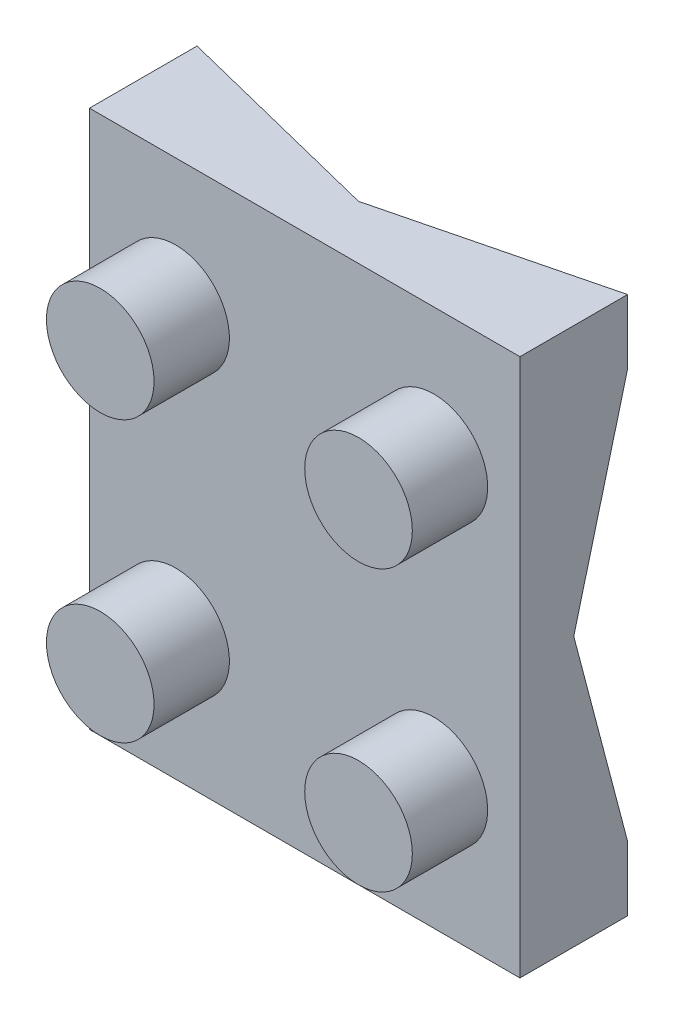
ISO-10303-21;
HEADER;
FILE_DESCRIPTION(('STEP AP214'),'2;1');
FILE_NAME('part.step','',(''),(''),'','','');
FILE_SCHEMA(('AUTOMOTIVE_DESIGN { 1 0 10303 214 1 1 1 1 }'));
ENDSEC;
DATA;
#1=APPLICATION_CONTEXT('core data for automotive mechanical design processes');
#2=APPLICATION_PROTOCOL_DEFINITION('international standard','automotive_design',2000,#1);
#3=PRODUCT_CONTEXT('',#1,'mechanical');
#4=PRODUCT('Part','Part','',(#3));
#5=PRODUCT_RELATED_PRODUCT_CATEGORY('part','',(#4));
#6=PRODUCT_DEFINITION_FORMATION('','',#4);
#7=PRODUCT_DEFINITION_CONTEXT('part definition',#1,'design');
#8=PRODUCT_DEFINITION('design','',#6,#7);
#9=PRODUCT_DEFINITION_SHAPE('','',#8);
#10=(LENGTH_UNIT() NAMED_UNIT(*) SI_UNIT(.MILLI.,.METRE.));
#11=(NAMED_UNIT(*) PLANE_ANGLE_UNIT() SI_UNIT($,.RADIAN.));
#12=(NAMED_UNIT(*) SI_UNIT($,.STERADIAN.) SOLID_ANGLE_UNIT());
#13=UNCERTAINTY_MEASURE_WITH_UNIT(LENGTH_MEASURE(1.E-05),#10,'distance_accuracy_value','');
#14=(GEOMETRIC_REPRESENTATION_CONTEXT(3) GLOBAL_UNCERTAINTY_ASSIGNED_CONTEXT((#13)) GLOBAL_UNIT_ASSIGNED_CONTEXT((#10,
#11,#12)) REPRESENTATION_CONTEXT('',''));
#15=CARTESIAN_POINT('',(0.,0.,0.));
#16=DIRECTION('',(0.,0.,1.));
#17=DIRECTION('',(1.,0.,0.));
#18=AXIS2_PLACEMENT_3D('',#15,#16,#17);
#19=CARTESIAN_POINT('',(-3.5,1.42487046632124,5.41450777202073));
#20=DIRECTION('',(0.,0.254493299279644,0.967074537262646));
#21=DIRECTION('',(0.,-0.967074537262647,0.254493299279644));
#22=AXIS2_PLACEMENT_3D('',#19,#20,#21);
#23=PLANE('',#22);
#24=DIRECTION('',(0.,-0.967074537262647,0.254493299279644));
#25=VECTOR('',#24,1.);
#26=CARTESIAN_POINT('',(0.,0.194300518134715,5.73834196891192));
#27=LINE('',#26,#25);
#28=CARTESIAN_POINT('',(0.,22.,0.));
#29=VERTEX_POINT('',#28);
#30=CARTESIAN_POINT('',(0.,12.5,2.5));
#31=VERTEX_POINT('',#30);
#32=EDGE_CURVE('E182',#29,#31,#27,.T.);
#33=ORIENTED_EDGE('',*,*,#32,.F.);
#34=DIRECTION('',(0.713376375006422,-0.6777075562561,0.178344093751605));
#35=VECTOR('',#34,1.);
#36=CARTESIAN_POINT('',(8.85496183206107,13.587786259542,2.21374045801527));
#37=LINE('',#36,#35);
#38=CARTESIAN_POINT('',(9.99999999999999,12.5,2.5));
#39=VERTEX_POINT('',#38);
#40=EDGE_CURVE('E178',#29,#39,#37,.T.);
#41=ORIENTED_EDGE('',*,*,#40,.T.);
#42=DIRECTION('',(1.,0.,0.));
#43=VECTOR('',#42,1.);
#44=CARTESIAN_POINT('',(-3.5,12.5,2.5));
#45=LINE('',#44,#43);
#46=EDGE_CURVE('E169',#31,#39,#45,.T.);
#47=ORIENTED_EDGE('',*,*,#46,.F.);
#48=EDGE_LOOP('',(#33,#41,#47));
#49=FACE_BOUND('',#48,.T.);
#50=ADVANCED_FACE('F41',(#49),#23,.F.);
#51=CARTESIAN_POINT('',(-3.5,0.194300518134715,-0.738341968911917));
#52=DIRECTION('',(0.,-0.254493299279644,0.967074537262646));
#53=DIRECTION('',(0.,-0.967074537262647,-0.254493299279644));
#54=AXIS2_PLACEMENT_3D('',#51,#52,#53);
#55=PLANE('',#54);
#56=ORIENTED_EDGE('',*,*,#46,.T.);
#57=DIRECTION('',(-0.713376375006422,-0.6777075562561,-0.178344093751605));
#58=VECTOR('',#57,1.);
#59=CARTESIAN_POINT('',(-3.23155216284987,-0.0699745547073758,-0.807888040712468));
#60=LINE('',#59,#58);
#61=CARTESIAN_POINT('',(0.,3.,0.));
#62=VERTEX_POINT('',#61);
#63=EDGE_CURVE('E11',#39,#62,#60,.T.);
#64=ORIENTED_EDGE('',*,*,#63,.T.);
#65=DIRECTION('',(0.,-0.967074537262647,-0.254493299279644));
#66=VECTOR('',#65,1.);
#67=CARTESIAN_POINT('',(0.,1.42487046632124,-0.414507772020725));
#68=LINE('',#67,#66);
#69=EDGE_CURVE('E177',#31,#62,#68,.T.);
#70=ORIENTED_EDGE('',*,*,#69,.F.);
#71=EDGE_LOOP('',(#56,#64,#70));
#72=FACE_BOUND('',#71,.T.);
#73=ADVANCED_FACE('F174',(#72),#55,.F.);
#74=CARTESIAN_POINT('',(0.,0.,5.));
#75=DIRECTION('',(1.,0.,0.));
#76=DIRECTION('',(0.,1.,0.));
#77=AXIS2_PLACEMENT_3D('',#74,#75,#76);
#78=PLANE('',#77);
#79=DIRECTION('',(0.,-1.,0.));
#80=VECTOR('',#79,1.);
#81=CARTESIAN_POINT('',(0.,0.,0.));
#82=LINE('',#81,#80);
#83=CARTESIAN_POINT('',(0.,25.,0.));
#84=VERTEX_POINT('',#83);
#85=EDGE_CURVE('E212',#84,#29,#82,.T.);
#86=ORIENTED_EDGE('',*,*,#85,.T.);
#87=ORIENTED_EDGE('',*,*,#32,.T.);
#88=ORIENTED_EDGE('',*,*,#69,.T.);
#89=CARTESIAN_POINT('',(0.,0.,0.));
#90=VERTEX_POINT('',#89);
#91=EDGE_CURVE('E208',#62,#90,#82,.T.);
#92=ORIENTED_EDGE('',*,*,#91,.T.);
#93=DIRECTION('',(0.,0.,-1.));
#94=VECTOR('',#93,1.);
#95=CARTESIAN_POINT('',(0.,0.,5.));
#96=LINE('',#95,#94);
#97=CARTESIAN_POINT('',(0.,0.,5.));
#98=VERTEX_POINT('',#97);
#99=EDGE_CURVE('E135',#98,#90,#96,.T.);
#100=ORIENTED_EDGE('',*,*,#99,.F.);
#101=DIRECTION('',(0.,-1.,0.));
#102=VECTOR('',#101,1.);
#103=CARTESIAN_POINT('',(0.,0.,5.));
#104=LINE('',#103,#102);
#105=CARTESIAN_POINT('',(0.,25.,5.));
#106=VERTEX_POINT('',#105);
#107=EDGE_CURVE('E122',#106,#98,#104,.T.);
#108=ORIENTED_EDGE('',*,*,#107,.F.);
#109=DIRECTION('',(0.,0.,-1.));
#110=VECTOR('',#109,1.);
#111=CARTESIAN_POINT('',(0.,25.,5.));
#112=LINE('',#111,#110);
#113=EDGE_CURVE('E143',#106,#84,#112,.T.);
#114=ORIENTED_EDGE('',*,*,#113,.T.);
#115=EDGE_LOOP('',(#86,#87,#88,#92,#100,#108,#114));
#116=FACE_BOUND('',#115,.T.);
#117=ADVANCED_FACE('F43',(#116),#78,.F.);
#118=CARTESIAN_POINT('',(0.,0.,5.));
#119=DIRECTION('',(0.,1.,0.));
#120=DIRECTION('',(0.,0.,1.));
#121=AXIS2_PLACEMENT_3D('',#118,#119,#120);
#122=PLANE('',#121);
#123=ORIENTED_EDGE('',*,*,#99,.T.);
#124=DIRECTION('',(-0.970142500145332,0.,-0.242535625036333));
#125=VECTOR('',#124,1.);
#126=CARTESIAN_POINT('',(0.,0.,0.));
#127=LINE('',#126,#125);
#128=CARTESIAN_POINT('',(10.,0.,2.5));
#129=VERTEX_POINT('',#128);
#130=EDGE_CURVE('E128',#129,#90,#127,.T.);
#131=ORIENTED_EDGE('',*,*,#130,.F.);
#132=DIRECTION('',(-0.970142500145332,0.,0.242535625036333));
#133=VECTOR('',#132,1.);
#134=CARTESIAN_POINT('',(10.,0.,2.5));
#135=LINE('',#134,#133);
#136=CARTESIAN_POINT('',(20.,0.,0.));
#137=VERTEX_POINT('',#136);
#138=EDGE_CURVE('E111',#137,#129,#135,.T.);
#139=ORIENTED_EDGE('',*,*,#138,.F.);
#140=DIRECTION('',(0.,0.,-1.));
#141=VECTOR('',#140,1.);
#142=CARTESIAN_POINT('',(20.,0.,5.));
#143=LINE('',#142,#141);
#144=CARTESIAN_POINT('',(20.,0.,5.));
#145=VERTEX_POINT('',#144);
#146=EDGE_CURVE('E126',#145,#137,#143,.T.);
#147=ORIENTED_EDGE('',*,*,#146,.F.);
#148=DIRECTION('',(1.,0.,0.));
#149=VECTOR('',#148,1.);
#150=CARTESIAN_POINT('',(0.,0.,5.));
#151=LINE('',#150,#149);
#152=EDGE_CURVE('E209',#98,#145,#151,.T.);
#153=ORIENTED_EDGE('',*,*,#152,.F.);
#154=EDGE_LOOP('',(#123,#131,#139,#147,#153));
#155=FACE_BOUND('',#154,.T.);
#156=ADVANCED_FACE('F130',(#155),#122,.F.);
#157=CARTESIAN_POINT('',(20.,0.,5.));
#158=DIRECTION('',(-1.,0.,0.));
#159=DIRECTION('',(0.,-1.,0.));
#160=AXIS2_PLACEMENT_3D('',#157,#158,#159);
#161=PLANE('',#160);
#162=DIRECTION('',(0.,-0.967074537262646,-0.254493299279644));
#163=VECTOR('',#162,1.);
#164=CARTESIAN_POINT('',(20.,0.194300518134719,-0.738341968911917));
#165=LINE('',#164,#163);
#166=CARTESIAN_POINT('',(20.,12.5,2.5));
#167=VERTEX_POINT('',#166);
#168=CARTESIAN_POINT('',(20.,3.00000000000002,0.));
#169=VERTEX_POINT('',#168);
#170=EDGE_CURVE('E159',#167,#169,#165,.T.);
#171=ORIENTED_EDGE('',*,*,#170,.F.);
#172=DIRECTION('',(0.,-0.967074537262646,0.254493299279644));
#173=VECTOR('',#172,1.);
#174=CARTESIAN_POINT('',(20.,1.42487046632125,5.41450777202073));
#175=LINE('',#174,#173);
#176=CARTESIAN_POINT('',(20.,22.,0.));
#177=VERTEX_POINT('',#176);
#178=EDGE_CURVE('E170',#177,#167,#175,.T.);
#179=ORIENTED_EDGE('',*,*,#178,.F.);
#180=DIRECTION('',(0.,1.,0.));
#181=VECTOR('',#180,1.);
#182=CARTESIAN_POINT('',(20.,0.,0.));
#183=LINE('',#182,#181);
#184=CARTESIAN_POINT('',(20.,25.,0.));
#185=VERTEX_POINT('',#184);
#186=EDGE_CURVE('E124',#177,#185,#183,.T.);
#187=ORIENTED_EDGE('',*,*,#186,.T.);
#188=DIRECTION('',(0.,0.,-1.));
#189=VECTOR('',#188,1.);
#190=CARTESIAN_POINT('',(20.,25.,5.));
#191=LINE('',#190,#189);
#192=CARTESIAN_POINT('',(20.,25.,5.));
#193=VERTEX_POINT('',#192);
#194=EDGE_CURVE('E137',#193,#185,#191,.T.);
#195=ORIENTED_EDGE('',*,*,#194,.F.);
#196=DIRECTION('',(0.,1.,0.));
#197=VECTOR('',#196,1.);
#198=CARTESIAN_POINT('',(20.,0.,5.));
#199=LINE('',#198,#197);
#200=EDGE_CURVE('E133',#145,#193,#199,.T.);
#201=ORIENTED_EDGE('',*,*,#200,.F.);
#202=ORIENTED_EDGE('',*,*,#146,.T.);
#203=EDGE_CURVE('E109',#137,#169,#183,.T.);
#204=ORIENTED_EDGE('',*,*,#203,.T.);
#205=EDGE_LOOP('',(#171,#179,#187,#195,#201,#202,#204));
#206=FACE_BOUND('',#205,.T.);
#207=ADVANCED_FACE('F132',(#206),#161,.F.);
#208=CARTESIAN_POINT('',(0.,25.,5.));
#209=DIRECTION('',(0.,-1.,0.));
#210=DIRECTION('',(0.,0.,-1.));
#211=AXIS2_PLACEMENT_3D('',#208,#209,#210);
#212=PLANE('',#211);
#213=DIRECTION('',(-0.970142500145332,0.,0.242535625036333));
#214=VECTOR('',#213,1.);
#215=CARTESIAN_POINT('',(0.,25.,5.));
#216=LINE('',#215,#214);
#217=CARTESIAN_POINT('',(10.,25.,2.5));
#218=VERTEX_POINT('',#217);
#219=EDGE_CURVE('E184',#185,#218,#216,.T.);
#220=ORIENTED_EDGE('',*,*,#219,.T.);
#221=DIRECTION('',(-0.970142500145332,0.,-0.242535625036333));
#222=VECTOR('',#221,1.);
#223=CARTESIAN_POINT('',(1.17647058823529,25.,0.294117647058822));
#224=LINE('',#223,#222);
#225=EDGE_CURVE('E181',#218,#84,#224,.T.);
#226=ORIENTED_EDGE('',*,*,#225,.T.);
#227=ORIENTED_EDGE('',*,*,#113,.F.);
#228=DIRECTION('',(-1.,0.,0.));
#229=VECTOR('',#228,1.);
#230=CARTESIAN_POINT('',(0.,25.,5.));
#231=LINE('',#230,#229);
#232=EDGE_CURVE('E63',#193,#106,#231,.T.);
#233=ORIENTED_EDGE('',*,*,#232,.F.);
#234=ORIENTED_EDGE('',*,*,#194,.T.);
#235=EDGE_LOOP('',(#220,#226,#227,#233,#234));
#236=FACE_BOUND('',#235,.T.);
#237=ADVANCED_FACE('F219',(#236),#212,.F.);
#238=CARTESIAN_POINT('',(0.,0.,5.));
#239=DIRECTION('',(0.,0.,-1.));
#240=DIRECTION('',(-1.,0.,0.));
#241=AXIS2_PLACEMENT_3D('',#238,#239,#240);
#242=PLANE('',#241);
#243=CARTESIAN_POINT('',(4.,6.,5.));
#244=DIRECTION('',(0.,0.,-1.));
#245=DIRECTION('',(-1.,0.,0.));
#246=AXIS2_PLACEMENT_3D('',#243,#244,#245);
#247=CIRCLE('',#246,2.5);
#248=CARTESIAN_POINT('',(1.5,6.,5.));
#249=VERTEX_POINT('',#248);
#250=EDGE_CURVE('E153',#249,#249,#247,.F.);
#251=ORIENTED_EDGE('',*,*,#250,.F.);
#252=EDGE_LOOP('',(#251));
#253=FACE_BOUND('',#252,.T.);
#254=CARTESIAN_POINT('',(16.,6.,5.));
#255=DIRECTION('',(0.,0.,-1.));
#256=DIRECTION('',(-1.,0.,0.));
#257=AXIS2_PLACEMENT_3D('',#254,#255,#256);
#258=CIRCLE('',#257,2.5);
#259=CARTESIAN_POINT('',(13.5,6.,5.));
#260=VERTEX_POINT('',#259);
#261=EDGE_CURVE('E147',#260,#260,#258,.F.);
#262=ORIENTED_EDGE('',*,*,#261,.F.);
#263=EDGE_LOOP('',(#262));
#264=FACE_BOUND('',#263,.T.);
#265=CARTESIAN_POINT('',(16.,19.,5.));
#266=DIRECTION('',(0.,0.,-1.));
#267=DIRECTION('',(-1.,0.,0.));
#268=AXIS2_PLACEMENT_3D('',#265,#266,#267);
#269=CIRCLE('',#268,2.5);
#270=CARTESIAN_POINT('',(13.5,19.,5.));
#271=VERTEX_POINT('',#270);
#272=EDGE_CURVE('E150',#271,#271,#269,.F.);
#273=ORIENTED_EDGE('',*,*,#272,.F.);
#274=EDGE_LOOP('',(#273));
#275=FACE_BOUND('',#274,.T.);
#276=CARTESIAN_POINT('',(4.,19.,5.));
#277=DIRECTION('',(0.,0.,-1.));
#278=DIRECTION('',(-1.,0.,0.));
#279=AXIS2_PLACEMENT_3D('',#276,#277,#278);
#280=CIRCLE('',#279,2.5);
#281=CARTESIAN_POINT('',(1.5,19.,5.));
#282=VERTEX_POINT('',#281);
#283=EDGE_CURVE('E140',#282,#282,#280,.F.);
#284=ORIENTED_EDGE('',*,*,#283,.F.);
#285=EDGE_LOOP('',(#284));
#286=FACE_BOUND('',#285,.T.);
#287=ORIENTED_EDGE('',*,*,#107,.T.);
#288=ORIENTED_EDGE('',*,*,#152,.T.);
#289=ORIENTED_EDGE('',*,*,#200,.T.);
#290=ORIENTED_EDGE('',*,*,#232,.T.);
#291=EDGE_LOOP('',(#287,#288,#289,#290));
#292=FACE_BOUND('',#291,.T.);
#293=ADVANCED_FACE('F232',(#253,#264,#275,#286,#292),#242,.F.);
#294=CARTESIAN_POINT('',(4.,19.,8.5));
#295=DIRECTION('',(0.,0.,-1.));
#296=DIRECTION('',(-1.,0.,0.));
#297=AXIS2_PLACEMENT_3D('',#294,#295,#296);
#298=CYLINDRICAL_SURFACE('',#297,2.5);
#299=CARTESIAN_POINT('',(4.,19.,8.5));
#300=DIRECTION('',(0.,0.,1.));
#301=DIRECTION('',(1.,0.,0.));
#302=AXIS2_PLACEMENT_3D('',#299,#300,#301);
#303=CIRCLE('',#302,2.5);
#304=CARTESIAN_POINT('',(6.5,19.,8.5));
#305=VERTEX_POINT('',#304);
#306=EDGE_CURVE('E202',#305,#305,#303,.T.);
#307=ORIENTED_EDGE('',*,*,#306,.F.);
#308=EDGE_LOOP('',(#307));
#309=FACE_BOUND('',#308,.T.);
#310=ORIENTED_EDGE('',*,*,#283,.T.);
#311=EDGE_LOOP('',(#310));
#312=FACE_BOUND('',#311,.T.);
#313=ADVANCED_FACE('F235',(#309,#312),#298,.T.);
#314=CARTESIAN_POINT('',(4.,19.,8.5));
#315=DIRECTION('',(0.,0.,1.));
#316=DIRECTION('',(1.,0.,0.));
#317=AXIS2_PLACEMENT_3D('',#314,#315,#316);
#318=PLANE('',#317);
#319=ORIENTED_EDGE('',*,*,#306,.T.);
#320=EDGE_LOOP('',(#319));
#321=FACE_BOUND('',#320,.T.);
#322=ADVANCED_FACE('F239',(#321),#318,.T.);
#323=CARTESIAN_POINT('',(16.,19.,8.5));
#324=DIRECTION('',(0.,0.,-1.));
#325=DIRECTION('',(-1.,0.,0.));
#326=AXIS2_PLACEMENT_3D('',#323,#324,#325);
#327=CYLINDRICAL_SURFACE('',#326,2.5);
#328=CARTESIAN_POINT('',(16.,19.,8.5));
#329=DIRECTION('',(0.,0.,1.));
#330=DIRECTION('',(1.,0.,0.));
#331=AXIS2_PLACEMENT_3D('',#328,#329,#330);
#332=CIRCLE('',#331,2.5);
#333=CARTESIAN_POINT('',(18.5,19.,8.5));
#334=VERTEX_POINT('',#333);
#335=EDGE_CURVE('E205',#334,#334,#332,.T.);
#336=ORIENTED_EDGE('',*,*,#335,.F.);
#337=EDGE_LOOP('',(#336));
#338=FACE_BOUND('',#337,.T.);
#339=ORIENTED_EDGE('',*,*,#272,.T.);
#340=EDGE_LOOP('',(#339));
#341=FACE_BOUND('',#340,.T.);
#342=ADVANCED_FACE('F277',(#338,#341),#327,.T.);
#343=CARTESIAN_POINT('',(16.,19.,8.5));
#344=DIRECTION('',(0.,0.,1.));
#345=DIRECTION('',(1.,0.,0.));
#346=AXIS2_PLACEMENT_3D('',#343,#344,#345);
#347=PLANE('',#346);
#348=ORIENTED_EDGE('',*,*,#335,.T.);
#349=EDGE_LOOP('',(#348));
#350=FACE_BOUND('',#349,.T.);
#351=ADVANCED_FACE('F271',(#350),#347,.T.);
#352=CARTESIAN_POINT('',(16.,6.,8.5));
#353=DIRECTION('',(0.,0.,-1.));
#354=DIRECTION('',(-1.,0.,0.));
#355=AXIS2_PLACEMENT_3D('',#352,#353,#354);
#356=CYLINDRICAL_SURFACE('',#355,2.5);
#357=CARTESIAN_POINT('',(16.,6.,8.5));
#358=DIRECTION('',(0.,0.,1.));
#359=DIRECTION('',(1.,0.,0.));
#360=AXIS2_PLACEMENT_3D('',#357,#358,#359);
#361=CIRCLE('',#360,2.5);
#362=CARTESIAN_POINT('',(18.5,6.,8.5));
#363=VERTEX_POINT('',#362);
#364=EDGE_CURVE('E200',#363,#363,#361,.T.);
#365=ORIENTED_EDGE('',*,*,#364,.F.);
#366=EDGE_LOOP('',(#365));
#367=FACE_BOUND('',#366,.T.);
#368=ORIENTED_EDGE('',*,*,#261,.T.);
#369=EDGE_LOOP('',(#368));
#370=FACE_BOUND('',#369,.T.);
#371=ADVANCED_FACE('F268',(#367,#370),#356,.T.);
#372=CARTESIAN_POINT('',(16.,6.,8.5));
#373=DIRECTION('',(0.,0.,1.));
#374=DIRECTION('',(1.,0.,0.));
#375=AXIS2_PLACEMENT_3D('',#372,#373,#374);
#376=PLANE('',#375);
#377=ORIENTED_EDGE('',*,*,#364,.T.);
#378=EDGE_LOOP('',(#377));
#379=FACE_BOUND('',#378,.T.);
#380=ADVANCED_FACE('F264',(#379),#376,.T.);
#381=CARTESIAN_POINT('',(4.,6.,8.5));
#382=DIRECTION('',(0.,0.,-1.));
#383=DIRECTION('',(-1.,0.,0.));
#384=AXIS2_PLACEMENT_3D('',#381,#382,#383);
#385=CYLINDRICAL_SURFACE('',#384,2.5);
#386=CARTESIAN_POINT('',(4.,6.,8.5));
#387=DIRECTION('',(0.,0.,1.));
#388=DIRECTION('',(1.,0.,0.));
#389=AXIS2_PLACEMENT_3D('',#386,#387,#388);
#390=CIRCLE('',#389,2.5);
#391=CARTESIAN_POINT('',(6.5,6.,8.5));
#392=VERTEX_POINT('',#391);
#393=EDGE_CURVE('E198',#392,#392,#390,.T.);
#394=ORIENTED_EDGE('',*,*,#393,.F.);
#395=EDGE_LOOP('',(#394));
#396=FACE_BOUND('',#395,.T.);
#397=ORIENTED_EDGE('',*,*,#250,.T.);
#398=EDGE_LOOP('',(#397));
#399=FACE_BOUND('',#398,.T.);
#400=ADVANCED_FACE('F259',(#396,#399),#385,.T.);
#401=CARTESIAN_POINT('',(4.,6.,8.5));
#402=DIRECTION('',(0.,0.,1.));
#403=DIRECTION('',(1.,0.,0.));
#404=AXIS2_PLACEMENT_3D('',#401,#402,#403);
#405=PLANE('',#404);
#406=ORIENTED_EDGE('',*,*,#393,.T.);
#407=EDGE_LOOP('',(#406));
#408=FACE_BOUND('',#407,.T.);
#409=ADVANCED_FACE('F254',(#408),#405,.T.);
#410=EDGE_CURVE('E158',#39,#167,#45,.T.);
#411=ORIENTED_EDGE('',*,*,#410,.F.);
#412=DIRECTION('',(0.713376375006422,0.6777075562561,-0.178344093751605));
#413=VECTOR('',#412,1.);
#414=CARTESIAN_POINT('',(-2.59541984732825,0.534351145038177,5.64885496183206));
#415=LINE('',#414,#413);
#416=EDGE_CURVE('E164',#39,#177,#415,.T.);
#417=ORIENTED_EDGE('',*,*,#416,.T.);
#418=ORIENTED_EDGE('',*,*,#178,.T.);
#419=EDGE_LOOP('',(#411,#417,#418));
#420=FACE_BOUND('',#419,.T.);
#421=ADVANCED_FACE('F163',(#420),#23,.F.);
#422=ORIENTED_EDGE('',*,*,#170,.T.);
#423=DIRECTION('',(-0.713376375006422,0.6777075562561,0.178344093751605));
#424=VECTOR('',#423,1.);
#425=CARTESIAN_POINT('',(9.49109414758269,12.9834605597964,2.62722646310433));
#426=LINE('',#425,#424);
#427=EDGE_CURVE('E47',#169,#39,#426,.T.);
#428=ORIENTED_EDGE('',*,*,#427,.T.);
#429=ORIENTED_EDGE('',*,*,#410,.T.);
#430=EDGE_LOOP('',(#422,#428,#429));
#431=FACE_BOUND('',#430,.T.);
#432=ADVANCED_FACE('F160',(#431),#55,.F.);
#433=CARTESIAN_POINT('',(10.,33.5,2.5));
#434=DIRECTION('',(0.242535625036333,0.,0.970142500145332));
#435=DIRECTION('',(0.970142500145332,0.,-0.242535625036333));
#436=AXIS2_PLACEMENT_3D('',#433,#434,#435);
#437=PLANE('',#436);
#438=ORIENTED_EDGE('',*,*,#203,.F.);
#439=ORIENTED_EDGE('',*,*,#138,.T.);
#440=DIRECTION('',(0.,-1.,0.));
#441=VECTOR('',#440,1.);
#442=CARTESIAN_POINT('',(10.,33.5,2.5));
#443=LINE('',#442,#441);
#444=EDGE_CURVE('E223',#39,#129,#443,.T.);
#445=ORIENTED_EDGE('',*,*,#444,.F.);
#446=ORIENTED_EDGE('',*,*,#427,.F.);
#447=EDGE_LOOP('',(#438,#439,#445,#446));
#448=FACE_BOUND('',#447,.T.);
#449=ADVANCED_FACE('F115',(#448),#437,.F.);
#450=CARTESIAN_POINT('',(0.,33.5,0.));
#451=DIRECTION('',(-0.242535625036333,0.,0.970142500145332));
#452=DIRECTION('',(0.970142500145332,0.,0.242535625036333));
#453=AXIS2_PLACEMENT_3D('',#450,#451,#452);
#454=PLANE('',#453);
#455=ORIENTED_EDGE('',*,*,#444,.T.);
#456=ORIENTED_EDGE('',*,*,#130,.T.);
#457=ORIENTED_EDGE('',*,*,#91,.F.);
#458=ORIENTED_EDGE('',*,*,#63,.F.);
#459=EDGE_LOOP('',(#455,#456,#457,#458));
#460=FACE_BOUND('',#459,.T.);
#461=ADVANCED_FACE('F230',(#460),#454,.F.);
#462=EDGE_CURVE('E57',#218,#39,#443,.T.);
#463=ORIENTED_EDGE('',*,*,#462,.T.);
#464=ORIENTED_EDGE('',*,*,#40,.F.);
#465=ORIENTED_EDGE('',*,*,#85,.F.);
#466=ORIENTED_EDGE('',*,*,#225,.F.);
#467=EDGE_LOOP('',(#463,#464,#465,#466));
#468=FACE_BOUND('',#467,.T.);
#469=ADVANCED_FACE('F222',(#468),#454,.F.);
#470=ORIENTED_EDGE('',*,*,#186,.F.);
#471=ORIENTED_EDGE('',*,*,#416,.F.);
#472=ORIENTED_EDGE('',*,*,#462,.F.);
#473=ORIENTED_EDGE('',*,*,#219,.F.);
#474=EDGE_LOOP('',(#470,#471,#472,#473));
#475=FACE_BOUND('',#474,.T.);
#476=ADVANCED_FACE('F224',(#475),#437,.F.);
#477=CLOSED_SHELL('',(#50,#73,#117,#156,#207,#237,#293,#313,#322,#342,#351,#371,#380,#400,#409,
#421,#432,#449,#461,#469,#476));
#478=MANIFOLD_SOLID_BREP('B2',#477);
#479=ADVANCED_BREP_SHAPE_REPRESENTATION('',(#18,#478),#14);
#480=SHAPE_DEFINITION_REPRESENTATION(#9,#479);
ENDSEC;
END-ISO-10303-21;
